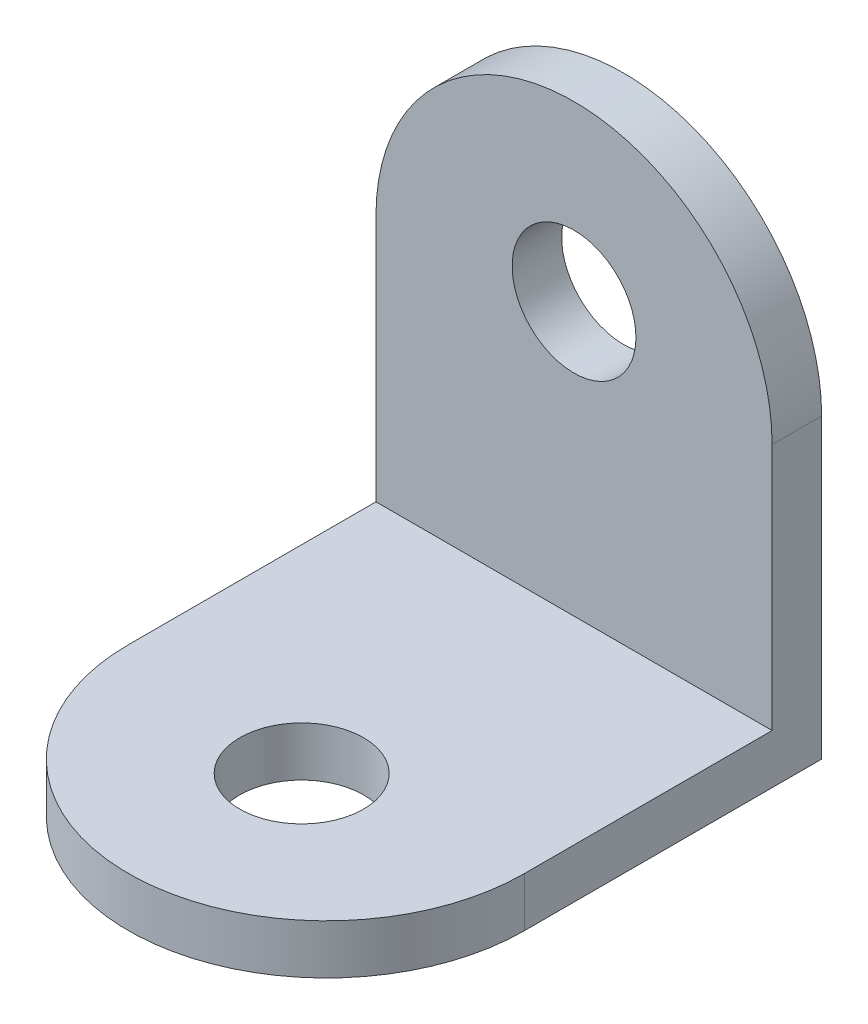
ISO-10303-21;
HEADER;
FILE_DESCRIPTION(('STEP AP214'),'2;1');
FILE_NAME('part.step','',(''),(''),'','','');
FILE_SCHEMA(('AUTOMOTIVE_DESIGN { 1 0 10303 214 1 1 1 1 }'));
ENDSEC;
DATA;
#1=APPLICATION_CONTEXT('core data for automotive mechanical design processes');
#2=APPLICATION_PROTOCOL_DEFINITION('international standard','automotive_design',2000,#1);
#3=PRODUCT_CONTEXT('',#1,'mechanical');
#4=PRODUCT('Part','Part','',(#3));
#5=PRODUCT_RELATED_PRODUCT_CATEGORY('part','',(#4));
#6=PRODUCT_DEFINITION_FORMATION('','',#4);
#7=PRODUCT_DEFINITION_CONTEXT('part definition',#1,'design');
#8=PRODUCT_DEFINITION('design','',#6,#7);
#9=PRODUCT_DEFINITION_SHAPE('','',#8);
#10=(LENGTH_UNIT() NAMED_UNIT(*) SI_UNIT(.MILLI.,.METRE.));
#11=(NAMED_UNIT(*) PLANE_ANGLE_UNIT() SI_UNIT($,.RADIAN.));
#12=(NAMED_UNIT(*) SI_UNIT($,.STERADIAN.) SOLID_ANGLE_UNIT());
#13=UNCERTAINTY_MEASURE_WITH_UNIT(LENGTH_MEASURE(1.E-05),#10,'distance_accuracy_value','');
#14=(GEOMETRIC_REPRESENTATION_CONTEXT(3) GLOBAL_UNCERTAINTY_ASSIGNED_CONTEXT((#13)) GLOBAL_UNIT_ASSIGNED_CONTEXT((#10,
#11,#12)) REPRESENTATION_CONTEXT('',''));
#15=CARTESIAN_POINT('',(0.,0.,0.));
#16=DIRECTION('',(0.,0.,1.));
#17=DIRECTION('',(1.,0.,0.));
#18=AXIS2_PLACEMENT_3D('',#15,#16,#17);
#19=CARTESIAN_POINT('',(0.,0.,2.));
#20=DIRECTION('',(0.,0.,1.));
#21=DIRECTION('',(1.,0.,0.));
#22=AXIS2_PLACEMENT_3D('',#19,#20,#21);
#23=PLANE('',#22);
#24=CARTESIAN_POINT('',(0.,1.,2.));
#25=DIRECTION('',(0.,0.,1.));
#26=DIRECTION('',(1.,0.,0.));
#27=AXIS2_PLACEMENT_3D('',#24,#25,#26);
#28=CIRCLE('',#27,2.5);
#29=CARTESIAN_POINT('',(2.5,1.,2.));
#30=VERTEX_POINT('',#29);
#31=EDGE_CURVE('E138',#30,#30,#28,.T.);
#32=ORIENTED_EDGE('',*,*,#31,.F.);
#33=EDGE_LOOP('',(#32));
#34=FACE_BOUND('',#33,.T.);
#35=DIRECTION('',(0.,-1.,0.));
#36=VECTOR('',#35,1.);
#37=CARTESIAN_POINT('',(-8.,0.,2.));
#38=LINE('',#37,#36);
#39=CARTESIAN_POINT('',(-8.,0.,2.));
#40=VERTEX_POINT('',#39);
#41=CARTESIAN_POINT('',(-8.,-10.,2.));
#42=VERTEX_POINT('',#41);
#43=EDGE_CURVE('E61',#40,#42,#38,.T.);
#44=ORIENTED_EDGE('',*,*,#43,.T.);
#45=DIRECTION('',(1.,0.,0.));
#46=VECTOR('',#45,1.);
#47=CARTESIAN_POINT('',(0.,-10.,2.));
#48=LINE('',#47,#46);
#49=CARTESIAN_POINT('',(8.,-10.,2.));
#50=VERTEX_POINT('',#49);
#51=EDGE_CURVE('E65',#42,#50,#48,.T.);
#52=ORIENTED_EDGE('',*,*,#51,.T.);
#53=DIRECTION('',(0.,1.,0.));
#54=VECTOR('',#53,1.);
#55=CARTESIAN_POINT('',(8.,-12.,2.));
#56=LINE('',#55,#54);
#57=CARTESIAN_POINT('',(8.,0.,2.));
#58=VERTEX_POINT('',#57);
#59=EDGE_CURVE('E152',#50,#58,#56,.T.);
#60=ORIENTED_EDGE('',*,*,#59,.T.);
#61=CARTESIAN_POINT('',(0.,0.,2.));
#62=DIRECTION('',(0.,0.,1.));
#63=DIRECTION('',(1.,0.,0.));
#64=AXIS2_PLACEMENT_3D('',#61,#62,#63);
#65=CIRCLE('',#64,8.);
#66=EDGE_CURVE('E146',#58,#40,#65,.T.);
#67=ORIENTED_EDGE('',*,*,#66,.T.);
#68=EDGE_LOOP('',(#44,#52,#60,#67));
#69=FACE_BOUND('',#68,.T.);
#70=ADVANCED_FACE('F45',(#34,#69),#23,.T.);
#71=CARTESIAN_POINT('',(0.,0.,0.));
#72=DIRECTION('',(0.,0.,1.));
#73=DIRECTION('',(1.,0.,0.));
#74=AXIS2_PLACEMENT_3D('',#71,#72,#73);
#75=PLANE('',#74);
#76=DIRECTION('',(1.,0.,0.));
#77=VECTOR('',#76,1.);
#78=CARTESIAN_POINT('',(-8.,-12.,0.));
#79=LINE('',#78,#77);
#80=CARTESIAN_POINT('',(-8.,-12.,0.));
#81=VERTEX_POINT('',#80);
#82=CARTESIAN_POINT('',(8.,-12.,0.));
#83=VERTEX_POINT('',#82);
#84=EDGE_CURVE('E162',#81,#83,#79,.T.);
#85=ORIENTED_EDGE('',*,*,#84,.F.);
#86=DIRECTION('',(0.,-1.,0.));
#87=VECTOR('',#86,1.);
#88=CARTESIAN_POINT('',(-8.,0.,0.));
#89=LINE('',#88,#87);
#90=CARTESIAN_POINT('',(-8.,0.,0.));
#91=VERTEX_POINT('',#90);
#92=EDGE_CURVE('E159',#91,#81,#89,.T.);
#93=ORIENTED_EDGE('',*,*,#92,.F.);
#94=CARTESIAN_POINT('',(0.,0.,0.));
#95=DIRECTION('',(0.,0.,1.));
#96=DIRECTION('',(1.,0.,0.));
#97=AXIS2_PLACEMENT_3D('',#94,#95,#96);
#98=CIRCLE('',#97,8.);
#99=CARTESIAN_POINT('',(8.,0.,0.));
#100=VERTEX_POINT('',#99);
#101=EDGE_CURVE('E142',#100,#91,#98,.T.);
#102=ORIENTED_EDGE('',*,*,#101,.F.);
#103=DIRECTION('',(0.,1.,0.));
#104=VECTOR('',#103,1.);
#105=CARTESIAN_POINT('',(8.,-12.,0.));
#106=LINE('',#105,#104);
#107=EDGE_CURVE('E149',#83,#100,#106,.T.);
#108=ORIENTED_EDGE('',*,*,#107,.F.);
#109=EDGE_LOOP('',(#85,#93,#102,#108));
#110=FACE_BOUND('',#109,.T.);
#111=CARTESIAN_POINT('',(0.,1.,0.));
#112=DIRECTION('',(0.,0.,1.));
#113=DIRECTION('',(1.,0.,0.));
#114=AXIS2_PLACEMENT_3D('',#111,#112,#113);
#115=CIRCLE('',#114,2.5);
#116=CARTESIAN_POINT('',(2.5,1.,0.));
#117=VERTEX_POINT('',#116);
#118=EDGE_CURVE('E137',#117,#117,#115,.T.);
#119=ORIENTED_EDGE('',*,*,#118,.T.);
#120=EDGE_LOOP('',(#119));
#121=FACE_BOUND('',#120,.T.);
#122=ADVANCED_FACE('F180',(#110,#121),#75,.F.);
#123=CARTESIAN_POINT('',(0.,0.,2.));
#124=DIRECTION('',(0.,0.,-1.));
#125=DIRECTION('',(-1.,0.,0.));
#126=AXIS2_PLACEMENT_3D('',#123,#124,#125);
#127=CYLINDRICAL_SURFACE('',#126,8.);
#128=ORIENTED_EDGE('',*,*,#101,.T.);
#129=DIRECTION('',(0.,0.,-1.));
#130=VECTOR('',#129,1.);
#131=CARTESIAN_POINT('',(-8.,0.,2.));
#132=LINE('',#131,#130);
#133=EDGE_CURVE('E11',#40,#91,#132,.T.);
#134=ORIENTED_EDGE('',*,*,#133,.F.);
#135=ORIENTED_EDGE('',*,*,#66,.F.);
#136=DIRECTION('',(0.,0.,-1.));
#137=VECTOR('',#136,1.);
#138=CARTESIAN_POINT('',(8.,0.,2.));
#139=LINE('',#138,#137);
#140=EDGE_CURVE('E155',#58,#100,#139,.T.);
#141=ORIENTED_EDGE('',*,*,#140,.T.);
#142=EDGE_LOOP('',(#128,#134,#135,#141));
#143=FACE_BOUND('',#142,.T.);
#144=ADVANCED_FACE('F47',(#143),#127,.T.);
#145=CARTESIAN_POINT('',(-8.,0.,2.));
#146=DIRECTION('',(1.,0.,0.));
#147=DIRECTION('',(0.,1.,0.));
#148=AXIS2_PLACEMENT_3D('',#145,#146,#147);
#149=PLANE('',#148);
#150=DIRECTION('',(0.,0.,-1.));
#151=VECTOR('',#150,1.);
#152=CARTESIAN_POINT('',(-8.,-12.,2.));
#153=LINE('',#152,#151);
#154=CARTESIAN_POINT('',(-8.,-12.,12.));
#155=VERTEX_POINT('',#154);
#156=EDGE_CURVE('E54',#155,#81,#153,.T.);
#157=ORIENTED_EDGE('',*,*,#156,.F.);
#158=DIRECTION('',(0.,-1.,0.));
#159=VECTOR('',#158,1.);
#160=CARTESIAN_POINT('',(-8.,-10.,12.));
#161=LINE('',#160,#159);
#162=CARTESIAN_POINT('',(-8.,-10.,12.));
#163=VERTEX_POINT('',#162);
#164=EDGE_CURVE('E97',#163,#155,#161,.T.);
#165=ORIENTED_EDGE('',*,*,#164,.F.);
#166=DIRECTION('',(0.,0.,-1.));
#167=VECTOR('',#166,1.);
#168=CARTESIAN_POINT('',(-8.,-10.,12.));
#169=LINE('',#168,#167);
#170=EDGE_CURVE('E100',#163,#42,#169,.T.);
#171=ORIENTED_EDGE('',*,*,#170,.T.);
#172=ORIENTED_EDGE('',*,*,#43,.F.);
#173=ORIENTED_EDGE('',*,*,#133,.T.);
#174=ORIENTED_EDGE('',*,*,#92,.T.);
#175=EDGE_LOOP('',(#157,#165,#171,#172,#173,#174));
#176=FACE_BOUND('',#175,.T.);
#177=ADVANCED_FACE('F99',(#176),#149,.F.);
#178=CARTESIAN_POINT('',(-8.,-12.,2.));
#179=DIRECTION('',(0.,1.,0.));
#180=DIRECTION('',(0.,0.,1.));
#181=AXIS2_PLACEMENT_3D('',#178,#179,#180);
#182=PLANE('',#181);
#183=ORIENTED_EDGE('',*,*,#84,.T.);
#184=DIRECTION('',(0.,0.,-1.));
#185=VECTOR('',#184,1.);
#186=CARTESIAN_POINT('',(8.,-12.,2.));
#187=LINE('',#186,#185);
#188=CARTESIAN_POINT('',(8.,-12.,12.));
#189=VERTEX_POINT('',#188);
#190=EDGE_CURVE('E170',#189,#83,#187,.T.);
#191=ORIENTED_EDGE('',*,*,#190,.F.);
#192=CARTESIAN_POINT('',(0.,-12.,12.));
#193=DIRECTION('',(0.,-1.,0.));
#194=DIRECTION('',(0.,0.,-1.));
#195=AXIS2_PLACEMENT_3D('',#192,#193,#194);
#196=CIRCLE('',#195,8.);
#197=EDGE_CURVE('E122',#189,#155,#196,.T.);
#198=ORIENTED_EDGE('',*,*,#197,.T.);
#199=ORIENTED_EDGE('',*,*,#156,.T.);
#200=EDGE_LOOP('',(#183,#191,#198,#199));
#201=FACE_BOUND('',#200,.T.);
#202=CARTESIAN_POINT('',(0.,-12.,13.));
#203=DIRECTION('',(0.,-1.,0.));
#204=DIRECTION('',(0.,0.,-1.));
#205=AXIS2_PLACEMENT_3D('',#202,#203,#204);
#206=CIRCLE('',#205,2.5);
#207=CARTESIAN_POINT('',(0.,-12.,10.5));
#208=VERTEX_POINT('',#207);
#209=EDGE_CURVE('E128',#208,#208,#206,.T.);
#210=ORIENTED_EDGE('',*,*,#209,.F.);
#211=EDGE_LOOP('',(#210));
#212=FACE_BOUND('',#211,.T.);
#213=ADVANCED_FACE('F176',(#201,#212),#182,.F.);
#214=CARTESIAN_POINT('',(8.,-12.,2.));
#215=DIRECTION('',(-1.,0.,0.));
#216=DIRECTION('',(0.,-1.,0.));
#217=AXIS2_PLACEMENT_3D('',#214,#215,#216);
#218=PLANE('',#217);
#219=ORIENTED_EDGE('',*,*,#107,.T.);
#220=ORIENTED_EDGE('',*,*,#140,.F.);
#221=ORIENTED_EDGE('',*,*,#59,.F.);
#222=DIRECTION('',(0.,0.,1.));
#223=VECTOR('',#222,1.);
#224=CARTESIAN_POINT('',(8.,-10.,0.));
#225=LINE('',#224,#223);
#226=CARTESIAN_POINT('',(8.,-10.,12.));
#227=VERTEX_POINT('',#226);
#228=EDGE_CURVE('E108',#50,#227,#225,.T.);
#229=ORIENTED_EDGE('',*,*,#228,.T.);
#230=DIRECTION('',(0.,-1.,0.));
#231=VECTOR('',#230,1.);
#232=CARTESIAN_POINT('',(8.,-10.,12.));
#233=LINE('',#232,#231);
#234=EDGE_CURVE('E107',#227,#189,#233,.T.);
#235=ORIENTED_EDGE('',*,*,#234,.T.);
#236=ORIENTED_EDGE('',*,*,#190,.T.);
#237=EDGE_LOOP('',(#219,#220,#221,#229,#235,#236));
#238=FACE_BOUND('',#237,.T.);
#239=ADVANCED_FACE('F185',(#238),#218,.F.);
#240=CARTESIAN_POINT('',(0.,1.,2.));
#241=DIRECTION('',(0.,0.,-1.));
#242=DIRECTION('',(-1.,0.,0.));
#243=AXIS2_PLACEMENT_3D('',#240,#241,#242);
#244=CYLINDRICAL_SURFACE('',#243,2.5);
#245=ORIENTED_EDGE('',*,*,#31,.T.);
#246=EDGE_LOOP('',(#245));
#247=FACE_BOUND('',#246,.T.);
#248=ORIENTED_EDGE('',*,*,#118,.F.);
#249=EDGE_LOOP('',(#248));
#250=FACE_BOUND('',#249,.T.);
#251=ADVANCED_FACE('F199',(#247,#250),#244,.F.);
#252=CARTESIAN_POINT('',(0.,-10.,12.));
#253=DIRECTION('',(0.,-1.,0.));
#254=DIRECTION('',(0.,0.,-1.));
#255=AXIS2_PLACEMENT_3D('',#252,#253,#254);
#256=CYLINDRICAL_SURFACE('',#255,8.);
#257=ORIENTED_EDGE('',*,*,#197,.F.);
#258=ORIENTED_EDGE('',*,*,#234,.F.);
#259=CARTESIAN_POINT('',(0.,-10.,12.));
#260=DIRECTION('',(0.,-1.,0.));
#261=DIRECTION('',(0.,0.,-1.));
#262=AXIS2_PLACEMENT_3D('',#259,#260,#261);
#263=CIRCLE('',#262,8.);
#264=EDGE_CURVE('E115',#227,#163,#263,.T.);
#265=ORIENTED_EDGE('',*,*,#264,.T.);
#266=ORIENTED_EDGE('',*,*,#164,.T.);
#267=EDGE_LOOP('',(#257,#258,#265,#266));
#268=FACE_BOUND('',#267,.T.);
#269=ADVANCED_FACE('F119',(#268),#256,.T.);
#270=CARTESIAN_POINT('',(0.,-10.,12.));
#271=DIRECTION('',(0.,-1.,0.));
#272=DIRECTION('',(0.,0.,-1.));
#273=AXIS2_PLACEMENT_3D('',#270,#271,#272);
#274=PLANE('',#273);
#275=ORIENTED_EDGE('',*,*,#51,.F.);
#276=ORIENTED_EDGE('',*,*,#170,.F.);
#277=ORIENTED_EDGE('',*,*,#264,.F.);
#278=ORIENTED_EDGE('',*,*,#228,.F.);
#279=EDGE_LOOP('',(#275,#276,#277,#278));
#280=FACE_BOUND('',#279,.T.);
#281=CARTESIAN_POINT('',(0.,-10.,13.));
#282=DIRECTION('',(0.,-1.,0.));
#283=DIRECTION('',(0.,0.,-1.));
#284=AXIS2_PLACEMENT_3D('',#281,#282,#283);
#285=CIRCLE('',#284,2.5);
#286=CARTESIAN_POINT('',(0.,-10.,10.5));
#287=VERTEX_POINT('',#286);
#288=EDGE_CURVE('E125',#287,#287,#285,.T.);
#289=ORIENTED_EDGE('',*,*,#288,.T.);
#290=EDGE_LOOP('',(#289));
#291=FACE_BOUND('',#290,.T.);
#292=ADVANCED_FACE('F112',(#280,#291),#274,.F.);
#293=CARTESIAN_POINT('',(0.,-10.,13.));
#294=DIRECTION('',(0.,-1.,0.));
#295=DIRECTION('',(0.,0.,-1.));
#296=AXIS2_PLACEMENT_3D('',#293,#294,#295);
#297=CYLINDRICAL_SURFACE('',#296,2.5);
#298=ORIENTED_EDGE('',*,*,#288,.F.);
#299=EDGE_LOOP('',(#298));
#300=FACE_BOUND('',#299,.T.);
#301=ORIENTED_EDGE('',*,*,#209,.T.);
#302=EDGE_LOOP('',(#301));
#303=FACE_BOUND('',#302,.T.);
#304=ADVANCED_FACE('F261',(#300,#303),#297,.F.);
#305=CLOSED_SHELL('',(#70,#122,#144,#177,#213,#239,#251,#269,#292,#304));
#306=MANIFOLD_SOLID_BREP('B2',#305);
#307=ADVANCED_BREP_SHAPE_REPRESENTATION('',(#18,#306),#14);
#308=SHAPE_DEFINITION_REPRESENTATION(#9,#307);
ENDSEC;
END-ISO-10303-21;
